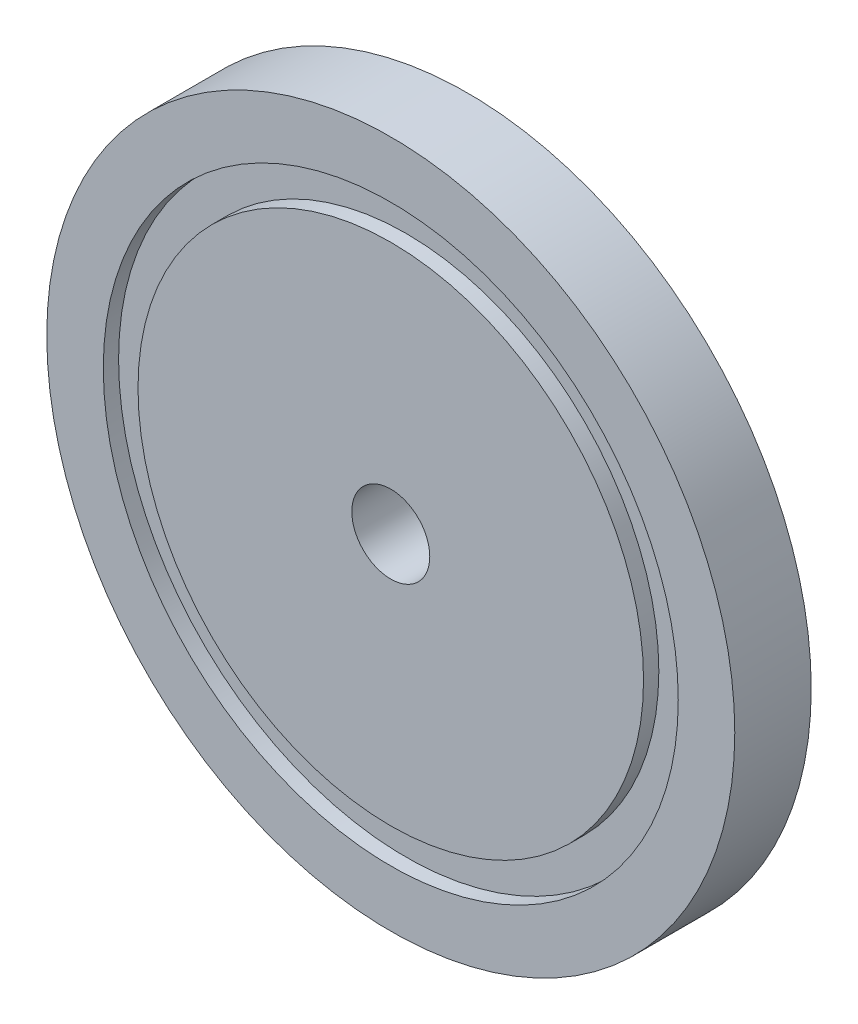
ISO-10303-21;
HEADER;
FILE_DESCRIPTION(('STEP AP214'),'2;1');
FILE_NAME('part.step','',(''),(''),'','','');
FILE_SCHEMA(('AUTOMOTIVE_DESIGN { 1 0 10303 214 1 1 1 1 }'));
ENDSEC;
DATA;
#1=APPLICATION_CONTEXT('core data for automotive mechanical design processes');
#2=APPLICATION_PROTOCOL_DEFINITION('international standard','automotive_design',2000,#1);
#3=PRODUCT_CONTEXT('',#1,'mechanical');
#4=PRODUCT('Part','Part','',(#3));
#5=PRODUCT_RELATED_PRODUCT_CATEGORY('part','',(#4));
#6=PRODUCT_DEFINITION_FORMATION('','',#4);
#7=PRODUCT_DEFINITION_CONTEXT('part definition',#1,'design');
#8=PRODUCT_DEFINITION('design','',#6,#7);
#9=PRODUCT_DEFINITION_SHAPE('','',#8);
#10=(LENGTH_UNIT() NAMED_UNIT(*) SI_UNIT(.MILLI.,.METRE.));
#11=(NAMED_UNIT(*) PLANE_ANGLE_UNIT() SI_UNIT($,.RADIAN.));
#12=(NAMED_UNIT(*) SI_UNIT($,.STERADIAN.) SOLID_ANGLE_UNIT());
#13=UNCERTAINTY_MEASURE_WITH_UNIT(LENGTH_MEASURE(1.E-05),#10,'distance_accuracy_value','');
#14=(GEOMETRIC_REPRESENTATION_CONTEXT(3) GLOBAL_UNCERTAINTY_ASSIGNED_CONTEXT((#13)) GLOBAL_UNIT_ASSIGNED_CONTEXT((#10,
#11,#12)) REPRESENTATION_CONTEXT('',''));
#15=CARTESIAN_POINT('',(0.,0.,0.));
#16=DIRECTION('',(0.,0.,1.));
#17=DIRECTION('',(1.,0.,0.));
#18=AXIS2_PLACEMENT_3D('',#15,#16,#17);
#19=CARTESIAN_POINT('',(0.,0.,5.));
#20=DIRECTION('',(0.,0.,1.));
#21=DIRECTION('',(1.,0.,0.));
#22=AXIS2_PLACEMENT_3D('',#19,#20,#21);
#23=PLANE('',#22);
#24=CARTESIAN_POINT('',(0.,0.,5.));
#25=DIRECTION('',(0.,0.,1.));
#26=DIRECTION('',(1.,0.,0.));
#27=AXIS2_PLACEMENT_3D('',#24,#25,#26);
#28=CIRCLE('',#27,2.55);
#29=CARTESIAN_POINT('',(2.55,0.,5.));
#30=VERTEX_POINT('',#29);
#31=EDGE_CURVE('E44',#30,#30,#28,.T.);
#32=ORIENTED_EDGE('',*,*,#31,.F.);
#33=EDGE_LOOP('',(#32));
#34=FACE_BOUND('',#33,.T.);
#35=CARTESIAN_POINT('',(0.,0.,5.));
#36=DIRECTION('',(0.,0.,1.));
#37=DIRECTION('',(1.,0.,0.));
#38=AXIS2_PLACEMENT_3D('',#35,#36,#37);
#39=CIRCLE('',#38,16.5325165396353);
#40=CARTESIAN_POINT('',(16.5325165396353,0.,5.));
#41=VERTEX_POINT('',#40);
#42=EDGE_CURVE('E56',#41,#41,#39,.T.);
#43=ORIENTED_EDGE('',*,*,#42,.T.);
#44=EDGE_LOOP('',(#43));
#45=FACE_BOUND('',#44,.T.);
#46=ADVANCED_FACE('F31',(#34,#45),#23,.T.);
#47=CARTESIAN_POINT('',(0.,0.,5.));
#48=DIRECTION('',(0.,0.,-1.));
#49=DIRECTION('',(-1.,0.,0.));
#50=AXIS2_PLACEMENT_3D('',#47,#48,#49);
#51=CYLINDRICAL_SURFACE('',#50,22.5);
#52=CARTESIAN_POINT('',(0.,0.,5.));
#53=DIRECTION('',(0.,0.,1.));
#54=DIRECTION('',(1.,0.,0.));
#55=AXIS2_PLACEMENT_3D('',#52,#53,#54);
#56=CIRCLE('',#55,22.5);
#57=CARTESIAN_POINT('',(22.5,0.,5.));
#58=VERTEX_POINT('',#57);
#59=EDGE_CURVE('E10',#58,#58,#56,.T.);
#60=ORIENTED_EDGE('',*,*,#59,.F.);
#61=EDGE_LOOP('',(#60));
#62=FACE_BOUND('',#61,.T.);
#63=CARTESIAN_POINT('',(0.,0.,0.));
#64=DIRECTION('',(0.,0.,1.));
#65=DIRECTION('',(1.,0.,0.));
#66=AXIS2_PLACEMENT_3D('',#63,#64,#65);
#67=CIRCLE('',#66,22.5);
#68=CARTESIAN_POINT('',(22.5,0.,0.));
#69=VERTEX_POINT('',#68);
#70=EDGE_CURVE('E35',#69,#69,#67,.T.);
#71=ORIENTED_EDGE('',*,*,#70,.T.);
#72=EDGE_LOOP('',(#71));
#73=FACE_BOUND('',#72,.T.);
#74=ADVANCED_FACE('F33',(#62,#73),#51,.T.);
#75=CARTESIAN_POINT('',(0.,0.,5.));
#76=DIRECTION('',(0.,0.,1.));
#77=DIRECTION('',(1.,0.,0.));
#78=AXIS2_PLACEMENT_3D('',#75,#76,#77);
#79=CIRCLE('',#78,18.8031453097719);
#80=CARTESIAN_POINT('',(18.8031453097719,0.,5.));
#81=VERTEX_POINT('',#80);
#82=EDGE_CURVE('E50',#81,#81,#79,.T.);
#83=ORIENTED_EDGE('',*,*,#82,.F.);
#84=EDGE_LOOP('',(#83));
#85=FACE_BOUND('',#84,.T.);
#86=ORIENTED_EDGE('',*,*,#59,.T.);
#87=EDGE_LOOP('',(#86));
#88=FACE_BOUND('',#87,.T.);
#89=ADVANCED_FACE('F78',(#85,#88),#23,.T.);
#90=CARTESIAN_POINT('',(0.,0.,0.));
#91=DIRECTION('',(0.,0.,1.));
#92=DIRECTION('',(1.,0.,0.));
#93=AXIS2_PLACEMENT_3D('',#90,#91,#92);
#94=PLANE('',#93);
#95=CARTESIAN_POINT('',(0.,0.,0.));
#96=DIRECTION('',(0.,0.,1.));
#97=DIRECTION('',(1.,0.,0.));
#98=AXIS2_PLACEMENT_3D('',#95,#96,#97);
#99=CIRCLE('',#98,2.55);
#100=CARTESIAN_POINT('',(2.55,0.,0.));
#101=VERTEX_POINT('',#100);
#102=EDGE_CURVE('E42',#101,#101,#99,.T.);
#103=ORIENTED_EDGE('',*,*,#102,.T.);
#104=EDGE_LOOP('',(#103));
#105=FACE_BOUND('',#104,.T.);
#106=ORIENTED_EDGE('',*,*,#70,.F.);
#107=EDGE_LOOP('',(#106));
#108=FACE_BOUND('',#107,.T.);
#109=ADVANCED_FACE('F80',(#105,#108),#94,.F.);
#110=CARTESIAN_POINT('',(0.,0.,0.));
#111=DIRECTION('',(0.,0.,1.));
#112=DIRECTION('',(1.,0.,0.));
#113=AXIS2_PLACEMENT_3D('',#110,#111,#112);
#114=CYLINDRICAL_SURFACE('',#113,2.55);
#115=ORIENTED_EDGE('',*,*,#102,.F.);
#116=EDGE_LOOP('',(#115));
#117=FACE_BOUND('',#116,.T.);
#118=ORIENTED_EDGE('',*,*,#31,.T.);
#119=EDGE_LOOP('',(#118));
#120=FACE_BOUND('',#119,.T.);
#121=ADVANCED_FACE('F74',(#117,#120),#114,.F.);
#122=CARTESIAN_POINT('',(0.,0.,4.));
#123=DIRECTION('',(0.,0.,1.));
#124=DIRECTION('',(1.,0.,0.));
#125=AXIS2_PLACEMENT_3D('',#122,#123,#124);
#126=CYLINDRICAL_SURFACE('',#125,18.8031453097719);
#127=CARTESIAN_POINT('',(0.,0.,4.));
#128=DIRECTION('',(0.,0.,1.));
#129=DIRECTION('',(1.,0.,0.));
#130=AXIS2_PLACEMENT_3D('',#127,#128,#129);
#131=CIRCLE('',#130,18.8031453097719);
#132=CARTESIAN_POINT('',(18.8031453097719,0.,4.));
#133=VERTEX_POINT('',#132);
#134=EDGE_CURVE('E47',#133,#133,#131,.T.);
#135=ORIENTED_EDGE('',*,*,#134,.F.);
#136=EDGE_LOOP('',(#135));
#137=FACE_BOUND('',#136,.T.);
#138=ORIENTED_EDGE('',*,*,#82,.T.);
#139=EDGE_LOOP('',(#138));
#140=FACE_BOUND('',#139,.T.);
#141=ADVANCED_FACE('F68',(#137,#140),#126,.F.);
#142=CARTESIAN_POINT('',(0.,0.,4.));
#143=DIRECTION('',(0.,0.,1.));
#144=DIRECTION('',(1.,0.,0.));
#145=AXIS2_PLACEMENT_3D('',#142,#143,#144);
#146=PLANE('',#145);
#147=CARTESIAN_POINT('',(0.,0.,4.));
#148=DIRECTION('',(0.,0.,1.));
#149=DIRECTION('',(1.,0.,0.));
#150=AXIS2_PLACEMENT_3D('',#147,#148,#149);
#151=CIRCLE('',#150,16.5325165396353);
#152=CARTESIAN_POINT('',(16.5325165396353,0.,4.));
#153=VERTEX_POINT('',#152);
#154=EDGE_CURVE('E53',#153,#153,#151,.T.);
#155=ORIENTED_EDGE('',*,*,#154,.F.);
#156=EDGE_LOOP('',(#155));
#157=FACE_BOUND('',#156,.T.);
#158=ORIENTED_EDGE('',*,*,#134,.T.);
#159=EDGE_LOOP('',(#158));
#160=FACE_BOUND('',#159,.T.);
#161=ADVANCED_FACE('F65',(#157,#160),#146,.T.);
#162=CARTESIAN_POINT('',(0.,0.,4.));
#163=DIRECTION('',(0.,0.,1.));
#164=DIRECTION('',(1.,0.,0.));
#165=AXIS2_PLACEMENT_3D('',#162,#163,#164);
#166=CYLINDRICAL_SURFACE('',#165,16.5325165396353);
#167=ORIENTED_EDGE('',*,*,#154,.T.);
#168=EDGE_LOOP('',(#167));
#169=FACE_BOUND('',#168,.T.);
#170=ORIENTED_EDGE('',*,*,#42,.F.);
#171=EDGE_LOOP('',(#170));
#172=FACE_BOUND('',#171,.T.);
#173=ADVANCED_FACE('F62',(#169,#172),#166,.T.);
#174=CLOSED_SHELL('',(#46,#74,#89,#109,#121,#141,#161,#173));
#175=MANIFOLD_SOLID_BREP('B2',#174);
#176=ADVANCED_BREP_SHAPE_REPRESENTATION('',(#18,#175),#14);
#177=SHAPE_DEFINITION_REPRESENTATION(#9,#176);
ENDSEC;
END-ISO-10303-21;
